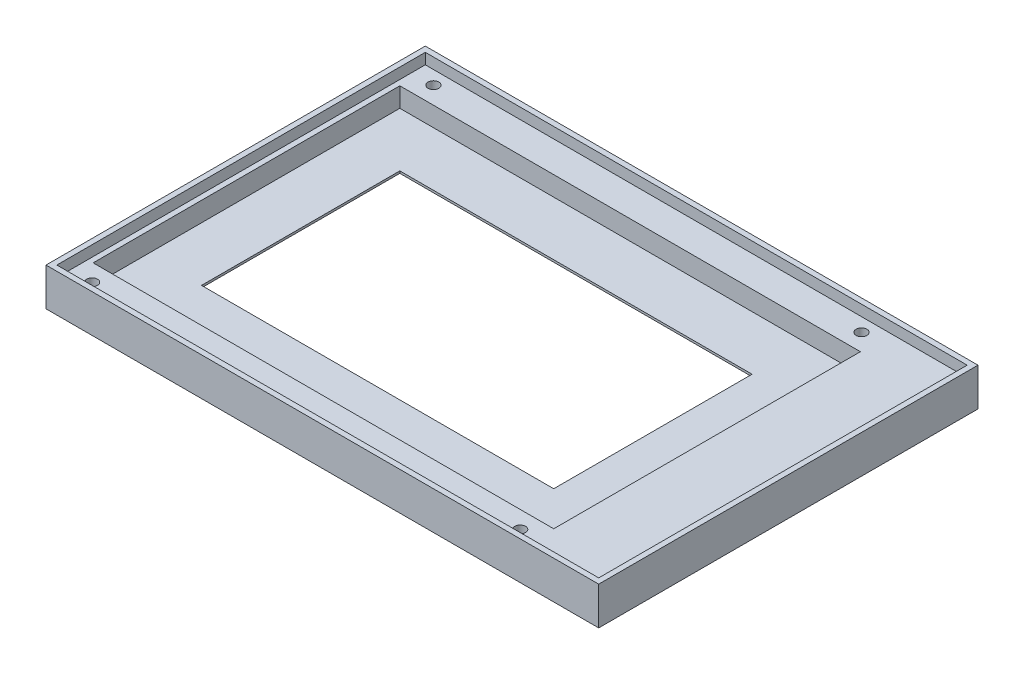
ISO-10303-21;
HEADER;
FILE_DESCRIPTION(('STEP AP214'),'2;1');
FILE_NAME('part.step','',(''),(''),'','','');
FILE_SCHEMA(('AUTOMOTIVE_DESIGN { 1 0 10303 214 1 1 1 1 }'));
ENDSEC;
DATA;
#1=APPLICATION_CONTEXT('core data for automotive mechanical design processes');
#2=APPLICATION_PROTOCOL_DEFINITION('international standard','automotive_design',2000,#1);
#3=PRODUCT_CONTEXT('',#1,'mechanical');
#4=PRODUCT('Part','Part','',(#3));
#5=PRODUCT_RELATED_PRODUCT_CATEGORY('part','',(#4));
#6=PRODUCT_DEFINITION_FORMATION('','',#4);
#7=PRODUCT_DEFINITION_CONTEXT('part definition',#1,'design');
#8=PRODUCT_DEFINITION('design','',#6,#7);
#9=PRODUCT_DEFINITION_SHAPE('','',#8);
#10=(LENGTH_UNIT() NAMED_UNIT(*) SI_UNIT(.MILLI.,.METRE.));
#11=(NAMED_UNIT(*) PLANE_ANGLE_UNIT() SI_UNIT($,.RADIAN.));
#12=(NAMED_UNIT(*) SI_UNIT($,.STERADIAN.) SOLID_ANGLE_UNIT());
#13=UNCERTAINTY_MEASURE_WITH_UNIT(LENGTH_MEASURE(1.E-05),#10,'distance_accuracy_value','');
#14=(GEOMETRIC_REPRESENTATION_CONTEXT(3) GLOBAL_UNCERTAINTY_ASSIGNED_CONTEXT((#13)) GLOBAL_UNIT_ASSIGNED_CONTEXT((#10,
#11,#12)) REPRESENTATION_CONTEXT('',''));
#15=CARTESIAN_POINT('',(0.,0.,0.));
#16=DIRECTION('',(0.,0.,1.));
#17=DIRECTION('',(1.,0.,0.));
#18=AXIS2_PLACEMENT_3D('',#15,#16,#17);
#19=CARTESIAN_POINT('',(-50.,1.,-34.));
#20=DIRECTION('',(-1.,0.,0.));
#21=DIRECTION('',(0.,0.,1.));
#22=AXIS2_PLACEMENT_3D('',#19,#20,#21);
#23=PLANE('',#22);
#24=DIRECTION('',(0.,0.,-1.));
#25=VECTOR('',#24,1.);
#26=CARTESIAN_POINT('',(-50.,1.,-34.));
#27=LINE('',#26,#25);
#28=CARTESIAN_POINT('',(-50.,1.,-3.5));
#29=VERTEX_POINT('',#28);
#30=CARTESIAN_POINT('',(-50.,1.,-34.));
#31=VERTEX_POINT('',#30);
#32=EDGE_CURVE('E293',#29,#31,#27,.T.);
#33=ORIENTED_EDGE('',*,*,#32,.F.);
#34=DIRECTION('',(0.,-1.,0.));
#35=VECTOR('',#34,1.);
#36=CARTESIAN_POINT('',(-50.,1.,-3.5));
#37=LINE('',#36,#35);
#38=CARTESIAN_POINT('',(-50.,0.,-3.5));
#39=VERTEX_POINT('',#38);
#40=EDGE_CURVE('E266',#29,#39,#37,.T.);
#41=ORIENTED_EDGE('',*,*,#40,.T.);
#42=DIRECTION('',(0.,0.,-1.));
#43=VECTOR('',#42,1.);
#44=CARTESIAN_POINT('',(-50.,0.,-34.));
#45=LINE('',#44,#43);
#46=CARTESIAN_POINT('',(-50.,0.,-34.));
#47=VERTEX_POINT('',#46);
#48=EDGE_CURVE('E305',#39,#47,#45,.T.);
#49=ORIENTED_EDGE('',*,*,#48,.T.);
#50=DIRECTION('',(0.,-1.,0.));
#51=VECTOR('',#50,1.);
#52=CARTESIAN_POINT('',(-50.,1.,-34.));
#53=LINE('',#52,#51);
#54=EDGE_CURVE('E314',#31,#47,#53,.T.);
#55=ORIENTED_EDGE('',*,*,#54,.F.);
#56=EDGE_LOOP('',(#33,#41,#49,#55));
#57=FACE_BOUND('',#56,.T.);
#58=ADVANCED_FACE('F35',(#57),#23,.F.);
#59=CARTESIAN_POINT('',(-46.,-1.,31.5));
#60=DIRECTION('',(0.,1.,0.));
#61=DIRECTION('',(0.,0.,1.));
#62=AXIS2_PLACEMENT_3D('',#59,#60,#61);
#63=CYLINDRICAL_SURFACE('',#62,0.999999999999998);
#64=CARTESIAN_POINT('',(-46.,5.,31.5));
#65=DIRECTION('',(0.,1.,0.));
#66=DIRECTION('',(0.,0.,1.));
#67=AXIS2_PLACEMENT_3D('',#64,#65,#66);
#68=CIRCLE('',#67,0.999999999999998);
#69=CARTESIAN_POINT('',(-46.,5.,32.5));
#70=VERTEX_POINT('',#69);
#71=EDGE_CURVE('E339',#70,#70,#68,.T.);
#72=ORIENTED_EDGE('',*,*,#71,.T.);
#73=EDGE_LOOP('',(#72));
#74=FACE_BOUND('',#73,.T.);
#75=CARTESIAN_POINT('',(-46.,1.,31.5));
#76=DIRECTION('',(0.,-1.,0.));
#77=DIRECTION('',(0.,0.,-1.));
#78=AXIS2_PLACEMENT_3D('',#75,#76,#77);
#79=CIRCLE('',#78,0.999999999999998);
#80=CARTESIAN_POINT('',(-46.,1.,30.5));
#81=VERTEX_POINT('',#80);
#82=EDGE_CURVE('E327',#81,#81,#79,.F.);
#83=ORIENTED_EDGE('',*,*,#82,.F.);
#84=EDGE_LOOP('',(#83));
#85=FACE_BOUND('',#84,.T.);
#86=ADVANCED_FACE('F463',(#74,#85),#63,.F.);
#87=CARTESIAN_POINT('',(33.,-1.,31.5));
#88=DIRECTION('',(0.,1.,0.));
#89=DIRECTION('',(0.,0.,1.));
#90=AXIS2_PLACEMENT_3D('',#87,#88,#89);
#91=CYLINDRICAL_SURFACE('',#90,0.999999999999998);
#92=CARTESIAN_POINT('',(33.,5.,31.5));
#93=DIRECTION('',(0.,1.,0.));
#94=DIRECTION('',(0.,0.,-1.));
#95=AXIS2_PLACEMENT_3D('',#92,#93,#94);
#96=CIRCLE('',#95,0.999999999999998);
#97=CARTESIAN_POINT('',(33.,5.,30.5));
#98=VERTEX_POINT('',#97);
#99=EDGE_CURVE('E336',#98,#98,#96,.T.);
#100=ORIENTED_EDGE('',*,*,#99,.T.);
#101=EDGE_LOOP('',(#100));
#102=FACE_BOUND('',#101,.T.);
#103=CARTESIAN_POINT('',(33.,1.,31.5));
#104=DIRECTION('',(0.,-1.,0.));
#105=DIRECTION('',(0.,0.,-1.));
#106=AXIS2_PLACEMENT_3D('',#103,#104,#105);
#107=CIRCLE('',#106,0.999999999999998);
#108=CARTESIAN_POINT('',(33.,1.,30.5));
#109=VERTEX_POINT('',#108);
#110=EDGE_CURVE('E324',#109,#109,#107,.F.);
#111=ORIENTED_EDGE('',*,*,#110,.F.);
#112=EDGE_LOOP('',(#111));
#113=FACE_BOUND('',#112,.T.);
#114=ADVANCED_FACE('F470',(#102,#113),#91,.F.);
#115=CARTESIAN_POINT('',(33.,-1.,-31.5));
#116=DIRECTION('',(0.,1.,0.));
#117=DIRECTION('',(0.,0.,1.));
#118=AXIS2_PLACEMENT_3D('',#115,#116,#117);
#119=CYLINDRICAL_SURFACE('',#118,0.999999999999998);
#120=CARTESIAN_POINT('',(33.,5.,-31.5));
#121=DIRECTION('',(0.,1.,0.));
#122=DIRECTION('',(0.,0.,1.));
#123=AXIS2_PLACEMENT_3D('',#120,#121,#122);
#124=CIRCLE('',#123,0.999999999999998);
#125=CARTESIAN_POINT('',(33.,5.,-30.5));
#126=VERTEX_POINT('',#125);
#127=EDGE_CURVE('E333',#126,#126,#124,.T.);
#128=ORIENTED_EDGE('',*,*,#127,.T.);
#129=EDGE_LOOP('',(#128));
#130=FACE_BOUND('',#129,.T.);
#131=CARTESIAN_POINT('',(33.,1.,-31.5));
#132=DIRECTION('',(0.,-1.,0.));
#133=DIRECTION('',(0.,0.,-1.));
#134=AXIS2_PLACEMENT_3D('',#131,#132,#133);
#135=CIRCLE('',#134,0.999999999999998);
#136=CARTESIAN_POINT('',(33.,1.,-32.5));
#137=VERTEX_POINT('',#136);
#138=EDGE_CURVE('E321',#137,#137,#135,.F.);
#139=ORIENTED_EDGE('',*,*,#138,.F.);
#140=EDGE_LOOP('',(#139));
#141=FACE_BOUND('',#140,.T.);
#142=ADVANCED_FACE('F532',(#130,#141),#119,.F.);
#143=CARTESIAN_POINT('',(-46.,-1.,-31.5));
#144=DIRECTION('',(0.,1.,0.));
#145=DIRECTION('',(0.,0.,1.));
#146=AXIS2_PLACEMENT_3D('',#143,#144,#145);
#147=CYLINDRICAL_SURFACE('',#146,0.999999999999998);
#148=CARTESIAN_POINT('',(-46.,5.,-31.5));
#149=DIRECTION('',(0.,1.,0.));
#150=DIRECTION('',(0.,0.,-1.));
#151=AXIS2_PLACEMENT_3D('',#148,#149,#150);
#152=CIRCLE('',#151,0.999999999999998);
#153=CARTESIAN_POINT('',(-46.,5.,-32.5));
#154=VERTEX_POINT('',#153);
#155=EDGE_CURVE('E330',#154,#154,#152,.T.);
#156=ORIENTED_EDGE('',*,*,#155,.T.);
#157=EDGE_LOOP('',(#156));
#158=FACE_BOUND('',#157,.T.);
#159=CARTESIAN_POINT('',(-46.,1.,-31.5));
#160=DIRECTION('',(0.,-1.,0.));
#161=DIRECTION('',(0.,0.,-1.));
#162=AXIS2_PLACEMENT_3D('',#159,#160,#161);
#163=CIRCLE('',#162,0.999999999999998);
#164=CARTESIAN_POINT('',(-46.,1.,-32.5));
#165=VERTEX_POINT('',#164);
#166=EDGE_CURVE('E313',#165,#165,#163,.F.);
#167=ORIENTED_EDGE('',*,*,#166,.F.);
#168=EDGE_LOOP('',(#167));
#169=FACE_BOUND('',#168,.T.);
#170=ADVANCED_FACE('F528',(#158,#169),#147,.F.);
#171=CARTESIAN_POINT('',(-51.,5.,35.));
#172=DIRECTION('',(1.,0.,0.));
#173=DIRECTION('',(0.,0.,-1.));
#174=AXIS2_PLACEMENT_3D('',#171,#172,#173);
#175=PLANE('',#174);
#176=DIRECTION('',(0.,0.,1.));
#177=VECTOR('',#176,1.);
#178=CARTESIAN_POINT('',(-51.,0.,35.));
#179=LINE('',#178,#177);
#180=CARTESIAN_POINT('',(-51.,0.,-35.));
#181=VERTEX_POINT('',#180);
#182=CARTESIAN_POINT('',(-51.,0.,-3.5));
#183=VERTEX_POINT('',#182);
#184=EDGE_CURVE('E375',#181,#183,#179,.T.);
#185=ORIENTED_EDGE('',*,*,#184,.T.);
#186=DIRECTION('',(0.,-1.,0.));
#187=VECTOR('',#186,1.);
#188=CARTESIAN_POINT('',(-51.,1.,-3.5));
#189=LINE('',#188,#187);
#190=CARTESIAN_POINT('',(-51.,1.,-3.5));
#191=VERTEX_POINT('',#190);
#192=EDGE_CURVE('E267',#191,#183,#189,.T.);
#193=ORIENTED_EDGE('',*,*,#192,.F.);
#194=DIRECTION('',(0.,0.,-1.));
#195=VECTOR('',#194,1.);
#196=CARTESIAN_POINT('',(-51.,1.,-3.5));
#197=LINE('',#196,#195);
#198=CARTESIAN_POINT('',(-51.,1.,3.5));
#199=VERTEX_POINT('',#198);
#200=EDGE_CURVE('E273',#199,#191,#197,.T.);
#201=ORIENTED_EDGE('',*,*,#200,.F.);
#202=DIRECTION('',(0.,1.,0.));
#203=VECTOR('',#202,1.);
#204=CARTESIAN_POINT('',(-51.,1.,3.5));
#205=LINE('',#204,#203);
#206=CARTESIAN_POINT('',(-51.,0.,3.5));
#207=VERTEX_POINT('',#206);
#208=EDGE_CURVE('E256',#207,#199,#205,.T.);
#209=ORIENTED_EDGE('',*,*,#208,.F.);
#210=CARTESIAN_POINT('',(-51.,0.,35.));
#211=VERTEX_POINT('',#210);
#212=EDGE_CURVE('E368',#207,#211,#179,.T.);
#213=ORIENTED_EDGE('',*,*,#212,.T.);
#214=DIRECTION('',(0.,-1.,0.));
#215=VECTOR('',#214,1.);
#216=CARTESIAN_POINT('',(-51.,5.,35.));
#217=LINE('',#216,#215);
#218=CARTESIAN_POINT('',(-51.,7.,35.));
#219=VERTEX_POINT('',#218);
#220=EDGE_CURVE('E393',#219,#211,#217,.T.);
#221=ORIENTED_EDGE('',*,*,#220,.F.);
#222=DIRECTION('',(0.,0.,1.));
#223=VECTOR('',#222,1.);
#224=CARTESIAN_POINT('',(-51.,7.,-35.));
#225=LINE('',#224,#223);
#226=CARTESIAN_POINT('',(-51.,7.,-35.));
#227=VERTEX_POINT('',#226);
#228=EDGE_CURVE('E209',#227,#219,#225,.T.);
#229=ORIENTED_EDGE('',*,*,#228,.F.);
#230=DIRECTION('',(0.,-1.,0.));
#231=VECTOR('',#230,1.);
#232=CARTESIAN_POINT('',(-51.,5.,-35.));
#233=LINE('',#232,#231);
#234=EDGE_CURVE('E384',#227,#181,#233,.T.);
#235=ORIENTED_EDGE('',*,*,#234,.T.);
#236=EDGE_LOOP('',(#185,#193,#201,#209,#213,#221,#229,#235));
#237=FACE_BOUND('',#236,.T.);
#238=ADVANCED_FACE('F37',(#237),#175,.F.);
#239=CARTESIAN_POINT('',(51.,5.,35.));
#240=DIRECTION('',(0.,0.,-1.));
#241=DIRECTION('',(-1.,0.,0.));
#242=AXIS2_PLACEMENT_3D('',#239,#240,#241);
#243=PLANE('',#242);
#244=DIRECTION('',(1.,0.,0.));
#245=VECTOR('',#244,1.);
#246=CARTESIAN_POINT('',(51.,0.,35.));
#247=LINE('',#246,#245);
#248=CARTESIAN_POINT('',(51.,0.,35.));
#249=VERTEX_POINT('',#248);
#250=EDGE_CURVE('E378',#211,#249,#247,.T.);
#251=ORIENTED_EDGE('',*,*,#250,.T.);
#252=DIRECTION('',(0.,-1.,0.));
#253=VECTOR('',#252,1.);
#254=CARTESIAN_POINT('',(51.,5.,35.));
#255=LINE('',#254,#253);
#256=CARTESIAN_POINT('',(51.,7.,35.));
#257=VERTEX_POINT('',#256);
#258=EDGE_CURVE('E390',#257,#249,#255,.T.);
#259=ORIENTED_EDGE('',*,*,#258,.F.);
#260=DIRECTION('',(1.,0.,0.));
#261=VECTOR('',#260,1.);
#262=CARTESIAN_POINT('',(-51.,7.,35.));
#263=LINE('',#262,#261);
#264=EDGE_CURVE('E233',#219,#257,#263,.T.);
#265=ORIENTED_EDGE('',*,*,#264,.F.);
#266=ORIENTED_EDGE('',*,*,#220,.T.);
#267=EDGE_LOOP('',(#251,#259,#265,#266));
#268=FACE_BOUND('',#267,.T.);
#269=ADVANCED_FACE('F521',(#268),#243,.F.);
#270=CARTESIAN_POINT('',(51.,5.,35.));
#271=DIRECTION('',(-1.,0.,0.));
#272=DIRECTION('',(0.,0.,1.));
#273=AXIS2_PLACEMENT_3D('',#270,#271,#272);
#274=PLANE('',#273);
#275=DIRECTION('',(0.,0.,-1.));
#276=VECTOR('',#275,1.);
#277=CARTESIAN_POINT('',(51.,0.,35.));
#278=LINE('',#277,#276);
#279=CARTESIAN_POINT('',(51.,0.,-35.));
#280=VERTEX_POINT('',#279);
#281=EDGE_CURVE('E380',#249,#280,#278,.T.);
#282=ORIENTED_EDGE('',*,*,#281,.T.);
#283=DIRECTION('',(0.,-1.,0.));
#284=VECTOR('',#283,1.);
#285=CARTESIAN_POINT('',(51.,5.,-35.));
#286=LINE('',#285,#284);
#287=CARTESIAN_POINT('',(51.,7.,-35.));
#288=VERTEX_POINT('',#287);
#289=EDGE_CURVE('E387',#288,#280,#286,.T.);
#290=ORIENTED_EDGE('',*,*,#289,.F.);
#291=DIRECTION('',(0.,0.,-1.));
#292=VECTOR('',#291,1.);
#293=CARTESIAN_POINT('',(51.,7.,35.));
#294=LINE('',#293,#292);
#295=EDGE_CURVE('E236',#257,#288,#294,.T.);
#296=ORIENTED_EDGE('',*,*,#295,.F.);
#297=ORIENTED_EDGE('',*,*,#258,.T.);
#298=EDGE_LOOP('',(#282,#290,#296,#297));
#299=FACE_BOUND('',#298,.T.);
#300=ADVANCED_FACE('F457',(#299),#274,.F.);
#301=CARTESIAN_POINT('',(51.,5.,-35.));
#302=DIRECTION('',(0.,0.,1.));
#303=DIRECTION('',(1.,0.,0.));
#304=AXIS2_PLACEMENT_3D('',#301,#302,#303);
#305=PLANE('',#304);
#306=DIRECTION('',(-1.,0.,0.));
#307=VECTOR('',#306,1.);
#308=CARTESIAN_POINT('',(51.,0.,-35.));
#309=LINE('',#308,#307);
#310=EDGE_CURVE('E382',#280,#181,#309,.T.);
#311=ORIENTED_EDGE('',*,*,#310,.T.);
#312=ORIENTED_EDGE('',*,*,#234,.F.);
#313=DIRECTION('',(-1.,0.,0.));
#314=VECTOR('',#313,1.);
#315=CARTESIAN_POINT('',(-51.,7.,-35.));
#316=LINE('',#315,#314);
#317=EDGE_CURVE('E239',#288,#227,#316,.T.);
#318=ORIENTED_EDGE('',*,*,#317,.F.);
#319=ORIENTED_EDGE('',*,*,#289,.T.);
#320=EDGE_LOOP('',(#311,#312,#318,#319));
#321=FACE_BOUND('',#320,.T.);
#322=ADVANCED_FACE('F449',(#321),#305,.F.);
#323=CARTESIAN_POINT('',(0.,5.,0.));
#324=DIRECTION('',(0.,1.,0.));
#325=DIRECTION('',(0.,0.,1.));
#326=AXIS2_PLACEMENT_3D('',#323,#324,#325);
#327=PLANE('',#326);
#328=DIRECTION('',(0.,0.,1.));
#329=VECTOR('',#328,1.);
#330=CARTESIAN_POINT('',(-50.,5.,34.));
#331=LINE('',#330,#329);
#332=CARTESIAN_POINT('',(-50.,5.,-34.));
#333=VERTEX_POINT('',#332);
#334=CARTESIAN_POINT('',(-50.,5.,34.));
#335=VERTEX_POINT('',#334);
#336=EDGE_CURVE('E50',#333,#335,#331,.T.);
#337=ORIENTED_EDGE('',*,*,#336,.T.);
#338=DIRECTION('',(1.,0.,0.));
#339=VECTOR('',#338,1.);
#340=CARTESIAN_POINT('',(50.,5.,34.));
#341=LINE('',#340,#339);
#342=CARTESIAN_POINT('',(50.,5.,34.));
#343=VERTEX_POINT('',#342);
#344=EDGE_CURVE('E54',#335,#343,#341,.T.);
#345=ORIENTED_EDGE('',*,*,#344,.T.);
#346=DIRECTION('',(0.,0.,-1.));
#347=VECTOR('',#346,1.);
#348=CARTESIAN_POINT('',(50.,5.,34.));
#349=LINE('',#348,#347);
#350=CARTESIAN_POINT('',(50.,5.,-34.));
#351=VERTEX_POINT('',#350);
#352=EDGE_CURVE('E223',#343,#351,#349,.T.);
#353=ORIENTED_EDGE('',*,*,#352,.T.);
#354=DIRECTION('',(-1.,0.,0.));
#355=VECTOR('',#354,1.);
#356=CARTESIAN_POINT('',(50.,5.,-34.));
#357=LINE('',#356,#355);
#358=EDGE_CURVE('E204',#351,#333,#357,.T.);
#359=ORIENTED_EDGE('',*,*,#358,.T.);
#360=EDGE_LOOP('',(#337,#345,#353,#359));
#361=FACE_BOUND('',#360,.T.);
#362=ORIENTED_EDGE('',*,*,#155,.F.);
#363=EDGE_LOOP('',(#362));
#364=FACE_BOUND('',#363,.T.);
#365=ORIENTED_EDGE('',*,*,#127,.F.);
#366=EDGE_LOOP('',(#365));
#367=FACE_BOUND('',#366,.T.);
#368=ORIENTED_EDGE('',*,*,#99,.F.);
#369=EDGE_LOOP('',(#368));
#370=FACE_BOUND('',#369,.T.);
#371=ORIENTED_EDGE('',*,*,#71,.F.);
#372=EDGE_LOOP('',(#371));
#373=FACE_BOUND('',#372,.T.);
#374=DIRECTION('',(0.,0.,-1.));
#375=VECTOR('',#374,1.);
#376=CARTESIAN_POINT('',(36.,5.,28.3));
#377=LINE('',#376,#375);
#378=CARTESIAN_POINT('',(36.,5.,28.3));
#379=VERTEX_POINT('',#378);
#380=CARTESIAN_POINT('',(36.,5.,-28.3));
#381=VERTEX_POINT('',#380);
#382=EDGE_CURVE('E342',#379,#381,#377,.T.);
#383=ORIENTED_EDGE('',*,*,#382,.F.);
#384=DIRECTION('',(1.,0.,0.));
#385=VECTOR('',#384,1.);
#386=CARTESIAN_POINT('',(-49.,5.,28.3));
#387=LINE('',#386,#385);
#388=CARTESIAN_POINT('',(-49.,5.,28.3));
#389=VERTEX_POINT('',#388);
#390=EDGE_CURVE('E347',#389,#379,#387,.T.);
#391=ORIENTED_EDGE('',*,*,#390,.F.);
#392=DIRECTION('',(0.,0.,1.));
#393=VECTOR('',#392,1.);
#394=CARTESIAN_POINT('',(-49.,5.,28.3));
#395=LINE('',#394,#393);
#396=CARTESIAN_POINT('',(-49.,5.,-28.3));
#397=VERTEX_POINT('',#396);
#398=EDGE_CURVE('E361',#397,#389,#395,.T.);
#399=ORIENTED_EDGE('',*,*,#398,.F.);
#400=DIRECTION('',(-1.,0.,0.));
#401=VECTOR('',#400,1.);
#402=CARTESIAN_POINT('',(-49.,5.,-28.3));
#403=LINE('',#402,#401);
#404=EDGE_CURVE('E358',#381,#397,#403,.T.);
#405=ORIENTED_EDGE('',*,*,#404,.F.);
#406=EDGE_LOOP('',(#383,#391,#399,#405));
#407=FACE_BOUND('',#406,.T.);
#408=ADVANCED_FACE('F446',(#361,#364,#367,#370,#373,#407),#327,.T.);
#409=CARTESIAN_POINT('',(0.,0.,0.));
#410=DIRECTION('',(0.,1.,0.));
#411=DIRECTION('',(0.,0.,1.));
#412=AXIS2_PLACEMENT_3D('',#409,#410,#411);
#413=PLANE('',#412);
#414=ORIENTED_EDGE('',*,*,#48,.F.);
#415=DIRECTION('',(-1.,0.,0.));
#416=VECTOR('',#415,1.);
#417=CARTESIAN_POINT('',(-50.,0.,-3.5));
#418=LINE('',#417,#416);
#419=EDGE_CURVE('E277',#39,#183,#418,.T.);
#420=ORIENTED_EDGE('',*,*,#419,.T.);
#421=ORIENTED_EDGE('',*,*,#184,.F.);
#422=ORIENTED_EDGE('',*,*,#310,.F.);
#423=ORIENTED_EDGE('',*,*,#281,.F.);
#424=ORIENTED_EDGE('',*,*,#250,.F.);
#425=ORIENTED_EDGE('',*,*,#212,.F.);
#426=DIRECTION('',(-1.,0.,0.));
#427=VECTOR('',#426,1.);
#428=CARTESIAN_POINT('',(-50.,0.,3.5));
#429=LINE('',#428,#427);
#430=CARTESIAN_POINT('',(-50.,0.,3.5));
#431=VERTEX_POINT('',#430);
#432=EDGE_CURVE('E270',#431,#207,#429,.T.);
#433=ORIENTED_EDGE('',*,*,#432,.F.);
#434=CARTESIAN_POINT('',(-50.,0.,34.));
#435=VERTEX_POINT('',#434);
#436=EDGE_CURVE('E306',#435,#431,#45,.T.);
#437=ORIENTED_EDGE('',*,*,#436,.F.);
#438=DIRECTION('',(-1.,0.,0.));
#439=VECTOR('',#438,1.);
#440=CARTESIAN_POINT('',(50.,0.,34.));
#441=LINE('',#440,#439);
#442=CARTESIAN_POINT('',(50.,0.,34.));
#443=VERTEX_POINT('',#442);
#444=EDGE_CURVE('E302',#443,#435,#441,.T.);
#445=ORIENTED_EDGE('',*,*,#444,.F.);
#446=DIRECTION('',(0.,0.,1.));
#447=VECTOR('',#446,1.);
#448=CARTESIAN_POINT('',(50.,0.,-34.));
#449=LINE('',#448,#447);
#450=CARTESIAN_POINT('',(50.,0.,-34.));
#451=VERTEX_POINT('',#450);
#452=EDGE_CURVE('E280',#451,#443,#449,.T.);
#453=ORIENTED_EDGE('',*,*,#452,.F.);
#454=DIRECTION('',(1.,0.,0.));
#455=VECTOR('',#454,1.);
#456=CARTESIAN_POINT('',(50.,0.,-34.));
#457=LINE('',#456,#455);
#458=EDGE_CURVE('E290',#47,#451,#457,.T.);
#459=ORIENTED_EDGE('',*,*,#458,.F.);
#460=EDGE_LOOP('',(#414,#420,#421,#422,#423,#424,#425,#433,#437,#445,#453,#459));
#461=FACE_BOUND('',#460,.T.);
#462=ADVANCED_FACE('F448',(#461),#413,.F.);
#463=CARTESIAN_POINT('',(36.,1.4,28.3));
#464=DIRECTION('',(1.,0.,0.));
#465=DIRECTION('',(0.,0.,-1.));
#466=AXIS2_PLACEMENT_3D('',#463,#464,#465);
#467=PLANE('',#466);
#468=ORIENTED_EDGE('',*,*,#382,.T.);
#469=DIRECTION('',(0.,1.,0.));
#470=VECTOR('',#469,1.);
#471=CARTESIAN_POINT('',(36.,1.4,-28.3));
#472=LINE('',#471,#470);
#473=CARTESIAN_POINT('',(36.,1.4,-28.3));
#474=VERTEX_POINT('',#473);
#475=EDGE_CURVE('E356',#474,#381,#472,.T.);
#476=ORIENTED_EDGE('',*,*,#475,.F.);
#477=DIRECTION('',(0.,0.,-1.));
#478=VECTOR('',#477,1.);
#479=CARTESIAN_POINT('',(36.,1.4,28.3));
#480=LINE('',#479,#478);
#481=CARTESIAN_POINT('',(36.,1.4,28.3));
#482=VERTEX_POINT('',#481);
#483=EDGE_CURVE('E343',#482,#474,#480,.T.);
#484=ORIENTED_EDGE('',*,*,#483,.F.);
#485=DIRECTION('',(0.,1.,0.));
#486=VECTOR('',#485,1.);
#487=CARTESIAN_POINT('',(36.,1.4,28.3));
#488=LINE('',#487,#486);
#489=EDGE_CURVE('E366',#482,#379,#488,.T.);
#490=ORIENTED_EDGE('',*,*,#489,.T.);
#491=EDGE_LOOP('',(#468,#476,#484,#490));
#492=FACE_BOUND('',#491,.T.);
#493=ADVANCED_FACE('F434',(#492),#467,.F.);
#494=CARTESIAN_POINT('',(-49.,1.4,28.3));
#495=DIRECTION('',(0.,0.,1.));
#496=DIRECTION('',(1.,0.,0.));
#497=AXIS2_PLACEMENT_3D('',#494,#495,#496);
#498=PLANE('',#497);
#499=ORIENTED_EDGE('',*,*,#390,.T.);
#500=ORIENTED_EDGE('',*,*,#489,.F.);
#501=DIRECTION('',(1.,0.,0.));
#502=VECTOR('',#501,1.);
#503=CARTESIAN_POINT('',(-49.,1.4,28.3));
#504=LINE('',#503,#502);
#505=CARTESIAN_POINT('',(-49.,1.4,28.3));
#506=VERTEX_POINT('',#505);
#507=EDGE_CURVE('E353',#506,#482,#504,.T.);
#508=ORIENTED_EDGE('',*,*,#507,.F.);
#509=DIRECTION('',(0.,1.,0.));
#510=VECTOR('',#509,1.);
#511=CARTESIAN_POINT('',(-49.,1.4,28.3));
#512=LINE('',#511,#510);
#513=EDGE_CURVE('E369',#506,#389,#512,.T.);
#514=ORIENTED_EDGE('',*,*,#513,.T.);
#515=EDGE_LOOP('',(#499,#500,#508,#514));
#516=FACE_BOUND('',#515,.T.);
#517=ADVANCED_FACE('F443',(#516),#498,.F.);
#518=CARTESIAN_POINT('',(-49.,1.4,28.3));
#519=DIRECTION('',(-1.,0.,0.));
#520=DIRECTION('',(0.,0.,1.));
#521=AXIS2_PLACEMENT_3D('',#518,#519,#520);
#522=PLANE('',#521);
#523=ORIENTED_EDGE('',*,*,#398,.T.);
#524=ORIENTED_EDGE('',*,*,#513,.F.);
#525=DIRECTION('',(0.,0.,1.));
#526=VECTOR('',#525,1.);
#527=CARTESIAN_POINT('',(-49.,1.4,28.3));
#528=LINE('',#527,#526);
#529=CARTESIAN_POINT('',(-49.,1.4,-28.3));
#530=VERTEX_POINT('',#529);
#531=EDGE_CURVE('E350',#530,#506,#528,.T.);
#532=ORIENTED_EDGE('',*,*,#531,.F.);
#533=DIRECTION('',(0.,1.,0.));
#534=VECTOR('',#533,1.);
#535=CARTESIAN_POINT('',(-49.,1.4,-28.3));
#536=LINE('',#535,#534);
#537=EDGE_CURVE('E371',#530,#397,#536,.T.);
#538=ORIENTED_EDGE('',*,*,#537,.T.);
#539=EDGE_LOOP('',(#523,#524,#532,#538));
#540=FACE_BOUND('',#539,.T.);
#541=ADVANCED_FACE('F441',(#540),#522,.F.);
#542=CARTESIAN_POINT('',(-49.,1.4,-28.3));
#543=DIRECTION('',(0.,0.,-1.));
#544=DIRECTION('',(-1.,0.,0.));
#545=AXIS2_PLACEMENT_3D('',#542,#543,#544);
#546=PLANE('',#545);
#547=ORIENTED_EDGE('',*,*,#404,.T.);
#548=ORIENTED_EDGE('',*,*,#537,.F.);
#549=DIRECTION('',(-1.,0.,0.));
#550=VECTOR('',#549,1.);
#551=CARTESIAN_POINT('',(-49.,1.4,-28.3));
#552=LINE('',#551,#550);
#553=EDGE_CURVE('E346',#474,#530,#552,.T.);
#554=ORIENTED_EDGE('',*,*,#553,.F.);
#555=ORIENTED_EDGE('',*,*,#475,.T.);
#556=EDGE_LOOP('',(#547,#548,#554,#555));
#557=FACE_BOUND('',#556,.T.);
#558=ADVANCED_FACE('F428',(#557),#546,.F.);
#559=CARTESIAN_POINT('',(0.,1.4,0.));
#560=DIRECTION('',(0.,-1.,0.));
#561=DIRECTION('',(0.,0.,-1.));
#562=AXIS2_PLACEMENT_3D('',#559,#560,#561);
#563=PLANE('',#562);
#564=DIRECTION('',(1.,0.,0.));
#565=VECTOR('',#564,1.);
#566=CARTESIAN_POINT('',(-39.,1.4,18.3));
#567=LINE('',#566,#565);
#568=CARTESIAN_POINT('',(-39.,1.4,18.3));
#569=VERTEX_POINT('',#568);
#570=CARTESIAN_POINT('',(26.,1.4,18.3));
#571=VERTEX_POINT('',#570);
#572=EDGE_CURVE('E244',#569,#571,#567,.T.);
#573=ORIENTED_EDGE('',*,*,#572,.F.);
#574=DIRECTION('',(0.,0.,1.));
#575=VECTOR('',#574,1.);
#576=CARTESIAN_POINT('',(-39.,1.4,-18.3));
#577=LINE('',#576,#575);
#578=CARTESIAN_POINT('',(-39.,1.4,-18.3));
#579=VERTEX_POINT('',#578);
#580=EDGE_CURVE('E242',#579,#569,#577,.T.);
#581=ORIENTED_EDGE('',*,*,#580,.F.);
#582=DIRECTION('',(-1.,0.,0.));
#583=VECTOR('',#582,1.);
#584=CARTESIAN_POINT('',(-39.,1.4,-18.3));
#585=LINE('',#584,#583);
#586=CARTESIAN_POINT('',(26.,1.4,-18.3));
#587=VERTEX_POINT('',#586);
#588=EDGE_CURVE('E250',#587,#579,#585,.T.);
#589=ORIENTED_EDGE('',*,*,#588,.F.);
#590=DIRECTION('',(0.,0.,-1.));
#591=VECTOR('',#590,1.);
#592=CARTESIAN_POINT('',(26.,1.4,-18.3));
#593=LINE('',#592,#591);
#594=EDGE_CURVE('E247',#571,#587,#593,.T.);
#595=ORIENTED_EDGE('',*,*,#594,.F.);
#596=EDGE_LOOP('',(#573,#581,#589,#595));
#597=FACE_BOUND('',#596,.T.);
#598=ORIENTED_EDGE('',*,*,#483,.T.);
#599=ORIENTED_EDGE('',*,*,#553,.T.);
#600=ORIENTED_EDGE('',*,*,#531,.T.);
#601=ORIENTED_EDGE('',*,*,#507,.T.);
#602=EDGE_LOOP('',(#598,#599,#600,#601));
#603=FACE_BOUND('',#602,.T.);
#604=ADVANCED_FACE('F425',(#597,#603),#563,.F.);
#605=CARTESIAN_POINT('',(0.,1.,0.));
#606=DIRECTION('',(0.,-1.,0.));
#607=DIRECTION('',(0.,0.,-1.));
#608=AXIS2_PLACEMENT_3D('',#605,#606,#607);
#609=PLANE('',#608);
#610=DIRECTION('',(0.,0.,-1.));
#611=VECTOR('',#610,1.);
#612=CARTESIAN_POINT('',(-39.,1.,0.));
#613=LINE('',#612,#611);
#614=CARTESIAN_POINT('',(-39.,1.,18.3));
#615=VERTEX_POINT('',#614);
#616=CARTESIAN_POINT('',(-39.,1.,-18.3));
#617=VERTEX_POINT('',#616);
#618=EDGE_CURVE('E11',#615,#617,#613,.T.);
#619=ORIENTED_EDGE('',*,*,#618,.F.);
#620=DIRECTION('',(-1.,0.,0.));
#621=VECTOR('',#620,1.);
#622=CARTESIAN_POINT('',(0.,1.,18.3));
#623=LINE('',#622,#621);
#624=CARTESIAN_POINT('',(26.,1.,18.3));
#625=VERTEX_POINT('',#624);
#626=EDGE_CURVE('E396',#625,#615,#623,.T.);
#627=ORIENTED_EDGE('',*,*,#626,.F.);
#628=DIRECTION('',(0.,0.,1.));
#629=VECTOR('',#628,1.);
#630=CARTESIAN_POINT('',(26.,1.,0.));
#631=LINE('',#630,#629);
#632=CARTESIAN_POINT('',(26.,1.,-18.3));
#633=VERTEX_POINT('',#632);
#634=EDGE_CURVE('E400',#633,#625,#631,.T.);
#635=ORIENTED_EDGE('',*,*,#634,.F.);
#636=DIRECTION('',(1.,0.,0.));
#637=VECTOR('',#636,1.);
#638=CARTESIAN_POINT('',(0.,1.,-18.3));
#639=LINE('',#638,#637);
#640=EDGE_CURVE('E43',#617,#633,#639,.T.);
#641=ORIENTED_EDGE('',*,*,#640,.F.);
#642=EDGE_LOOP('',(#619,#627,#635,#641));
#643=FACE_BOUND('',#642,.T.);
#644=DIRECTION('',(0.,0.,1.));
#645=VECTOR('',#644,1.);
#646=CARTESIAN_POINT('',(50.,1.,-34.));
#647=LINE('',#646,#645);
#648=CARTESIAN_POINT('',(50.,1.,-34.));
#649=VERTEX_POINT('',#648);
#650=CARTESIAN_POINT('',(50.,1.,34.));
#651=VERTEX_POINT('',#650);
#652=EDGE_CURVE('E286',#649,#651,#647,.T.);
#653=ORIENTED_EDGE('',*,*,#652,.T.);
#654=DIRECTION('',(-1.,0.,0.));
#655=VECTOR('',#654,1.);
#656=CARTESIAN_POINT('',(50.,1.,34.));
#657=LINE('',#656,#655);
#658=CARTESIAN_POINT('',(-50.,1.,34.));
#659=VERTEX_POINT('',#658);
#660=EDGE_CURVE('E289',#651,#659,#657,.T.);
#661=ORIENTED_EDGE('',*,*,#660,.T.);
#662=CARTESIAN_POINT('',(-50.,1.,3.5));
#663=VERTEX_POINT('',#662);
#664=EDGE_CURVE('E294',#659,#663,#27,.T.);
#665=ORIENTED_EDGE('',*,*,#664,.T.);
#666=DIRECTION('',(-1.,0.,0.));
#667=VECTOR('',#666,1.);
#668=CARTESIAN_POINT('',(-50.,1.,3.5));
#669=LINE('',#668,#667);
#670=EDGE_CURVE('E283',#663,#199,#669,.T.);
#671=ORIENTED_EDGE('',*,*,#670,.T.);
#672=ORIENTED_EDGE('',*,*,#200,.T.);
#673=DIRECTION('',(-1.,0.,0.));
#674=VECTOR('',#673,1.);
#675=CARTESIAN_POINT('',(-50.,1.,-3.5));
#676=LINE('',#675,#674);
#677=EDGE_CURVE('E281',#29,#191,#676,.T.);
#678=ORIENTED_EDGE('',*,*,#677,.F.);
#679=ORIENTED_EDGE('',*,*,#32,.T.);
#680=DIRECTION('',(1.,0.,0.));
#681=VECTOR('',#680,1.);
#682=CARTESIAN_POINT('',(50.,1.,-34.));
#683=LINE('',#682,#681);
#684=EDGE_CURVE('E297',#31,#649,#683,.T.);
#685=ORIENTED_EDGE('',*,*,#684,.T.);
#686=EDGE_LOOP('',(#653,#661,#665,#671,#672,#678,#679,#685));
#687=FACE_BOUND('',#686,.T.);
#688=ORIENTED_EDGE('',*,*,#166,.T.);
#689=EDGE_LOOP('',(#688));
#690=FACE_BOUND('',#689,.T.);
#691=ORIENTED_EDGE('',*,*,#138,.T.);
#692=EDGE_LOOP('',(#691));
#693=FACE_BOUND('',#692,.T.);
#694=ORIENTED_EDGE('',*,*,#110,.T.);
#695=EDGE_LOOP('',(#694));
#696=FACE_BOUND('',#695,.T.);
#697=ORIENTED_EDGE('',*,*,#82,.T.);
#698=EDGE_LOOP('',(#697));
#699=FACE_BOUND('',#698,.T.);
#700=ADVANCED_FACE('F415',(#643,#687,#690,#693,#696,#699),#609,.T.);
#701=CARTESIAN_POINT('',(50.,1.,-34.));
#702=DIRECTION('',(1.,0.,0.));
#703=DIRECTION('',(0.,0.,-1.));
#704=AXIS2_PLACEMENT_3D('',#701,#702,#703);
#705=PLANE('',#704);
#706=ORIENTED_EDGE('',*,*,#452,.T.);
#707=DIRECTION('',(0.,-1.,0.));
#708=VECTOR('',#707,1.);
#709=CARTESIAN_POINT('',(50.,1.,34.));
#710=LINE('',#709,#708);
#711=EDGE_CURVE('E300',#651,#443,#710,.T.);
#712=ORIENTED_EDGE('',*,*,#711,.F.);
#713=ORIENTED_EDGE('',*,*,#652,.F.);
#714=DIRECTION('',(0.,-1.,0.));
#715=VECTOR('',#714,1.);
#716=CARTESIAN_POINT('',(50.,1.,-34.));
#717=LINE('',#716,#715);
#718=EDGE_CURVE('E311',#649,#451,#717,.T.);
#719=ORIENTED_EDGE('',*,*,#718,.T.);
#720=EDGE_LOOP('',(#706,#712,#713,#719));
#721=FACE_BOUND('',#720,.T.);
#722=ADVANCED_FACE('F486',(#721),#705,.F.);
#723=CARTESIAN_POINT('',(50.,1.,-34.));
#724=DIRECTION('',(0.,0.,-1.));
#725=DIRECTION('',(-1.,0.,0.));
#726=AXIS2_PLACEMENT_3D('',#723,#724,#725);
#727=PLANE('',#726);
#728=ORIENTED_EDGE('',*,*,#458,.T.);
#729=ORIENTED_EDGE('',*,*,#718,.F.);
#730=ORIENTED_EDGE('',*,*,#684,.F.);
#731=ORIENTED_EDGE('',*,*,#54,.T.);
#732=EDGE_LOOP('',(#728,#729,#730,#731));
#733=FACE_BOUND('',#732,.T.);
#734=ADVANCED_FACE('F478',(#733),#727,.F.);
#735=ORIENTED_EDGE('',*,*,#436,.T.);
#736=DIRECTION('',(0.,1.,0.));
#737=VECTOR('',#736,1.);
#738=CARTESIAN_POINT('',(-50.,1.,3.5));
#739=LINE('',#738,#737);
#740=EDGE_CURVE('E263',#431,#663,#739,.T.);
#741=ORIENTED_EDGE('',*,*,#740,.T.);
#742=ORIENTED_EDGE('',*,*,#664,.F.);
#743=DIRECTION('',(0.,-1.,0.));
#744=VECTOR('',#743,1.);
#745=CARTESIAN_POINT('',(-50.,1.,34.));
#746=LINE('',#745,#744);
#747=EDGE_CURVE('E317',#659,#435,#746,.T.);
#748=ORIENTED_EDGE('',*,*,#747,.T.);
#749=EDGE_LOOP('',(#735,#741,#742,#748));
#750=FACE_BOUND('',#749,.T.);
#751=ADVANCED_FACE('F466',(#750),#23,.F.);
#752=CARTESIAN_POINT('',(50.,1.,34.));
#753=DIRECTION('',(0.,0.,1.));
#754=DIRECTION('',(1.,0.,0.));
#755=AXIS2_PLACEMENT_3D('',#752,#753,#754);
#756=PLANE('',#755);
#757=ORIENTED_EDGE('',*,*,#444,.T.);
#758=ORIENTED_EDGE('',*,*,#747,.F.);
#759=ORIENTED_EDGE('',*,*,#660,.F.);
#760=ORIENTED_EDGE('',*,*,#711,.T.);
#761=EDGE_LOOP('',(#757,#758,#759,#760));
#762=FACE_BOUND('',#761,.T.);
#763=ADVANCED_FACE('F477',(#762),#756,.F.);
#764=CARTESIAN_POINT('',(-50.,1.,-3.5));
#765=DIRECTION('',(0.,0.,-1.));
#766=DIRECTION('',(-1.,0.,0.));
#767=AXIS2_PLACEMENT_3D('',#764,#765,#766);
#768=PLANE('',#767);
#769=ORIENTED_EDGE('',*,*,#192,.T.);
#770=ORIENTED_EDGE('',*,*,#419,.F.);
#771=ORIENTED_EDGE('',*,*,#40,.F.);
#772=ORIENTED_EDGE('',*,*,#677,.T.);
#773=EDGE_LOOP('',(#769,#770,#771,#772));
#774=FACE_BOUND('',#773,.T.);
#775=ADVANCED_FACE('F484',(#774),#768,.F.);
#776=CARTESIAN_POINT('',(-50.,1.,3.5));
#777=DIRECTION('',(0.,0.,1.));
#778=DIRECTION('',(1.,0.,0.));
#779=AXIS2_PLACEMENT_3D('',#776,#777,#778);
#780=PLANE('',#779);
#781=ORIENTED_EDGE('',*,*,#208,.T.);
#782=ORIENTED_EDGE('',*,*,#670,.F.);
#783=ORIENTED_EDGE('',*,*,#740,.F.);
#784=ORIENTED_EDGE('',*,*,#432,.T.);
#785=EDGE_LOOP('',(#781,#782,#783,#784));
#786=FACE_BOUND('',#785,.T.);
#787=ADVANCED_FACE('F498',(#786),#780,.F.);
#788=CARTESIAN_POINT('',(-39.,-8.6,-18.3));
#789=DIRECTION('',(-1.,0.,0.));
#790=DIRECTION('',(0.,0.,1.));
#791=AXIS2_PLACEMENT_3D('',#788,#789,#790);
#792=PLANE('',#791);
#793=ORIENTED_EDGE('',*,*,#618,.T.);
#794=DIRECTION('',(0.,1.,0.));
#795=VECTOR('',#794,1.);
#796=CARTESIAN_POINT('',(-39.,-8.6,-18.3));
#797=LINE('',#796,#795);
#798=EDGE_CURVE('E254',#617,#579,#797,.T.);
#799=ORIENTED_EDGE('',*,*,#798,.T.);
#800=ORIENTED_EDGE('',*,*,#580,.T.);
#801=DIRECTION('',(0.,1.,0.));
#802=VECTOR('',#801,1.);
#803=CARTESIAN_POINT('',(-39.,-8.6,18.3));
#804=LINE('',#803,#802);
#805=EDGE_CURVE('E253',#615,#569,#804,.T.);
#806=ORIENTED_EDGE('',*,*,#805,.F.);
#807=EDGE_LOOP('',(#793,#799,#800,#806));
#808=FACE_BOUND('',#807,.T.);
#809=ADVANCED_FACE('F422',(#808),#792,.F.);
#810=CARTESIAN_POINT('',(-39.,-8.6,-18.3));
#811=DIRECTION('',(0.,0.,-1.));
#812=DIRECTION('',(-1.,0.,0.));
#813=AXIS2_PLACEMENT_3D('',#810,#811,#812);
#814=PLANE('',#813);
#815=ORIENTED_EDGE('',*,*,#640,.T.);
#816=DIRECTION('',(0.,1.,0.));
#817=VECTOR('',#816,1.);
#818=CARTESIAN_POINT('',(26.,-8.6,-18.3));
#819=LINE('',#818,#817);
#820=EDGE_CURVE('E257',#633,#587,#819,.T.);
#821=ORIENTED_EDGE('',*,*,#820,.T.);
#822=ORIENTED_EDGE('',*,*,#588,.T.);
#823=ORIENTED_EDGE('',*,*,#798,.F.);
#824=EDGE_LOOP('',(#815,#821,#822,#823));
#825=FACE_BOUND('',#824,.T.);
#826=ADVANCED_FACE('F406',(#825),#814,.F.);
#827=CARTESIAN_POINT('',(26.,-8.6,-18.3));
#828=DIRECTION('',(1.,0.,0.));
#829=DIRECTION('',(0.,0.,-1.));
#830=AXIS2_PLACEMENT_3D('',#827,#828,#829);
#831=PLANE('',#830);
#832=ORIENTED_EDGE('',*,*,#634,.T.);
#833=DIRECTION('',(0.,1.,0.));
#834=VECTOR('',#833,1.);
#835=CARTESIAN_POINT('',(26.,-8.6,18.3));
#836=LINE('',#835,#834);
#837=EDGE_CURVE('E259',#625,#571,#836,.T.);
#838=ORIENTED_EDGE('',*,*,#837,.T.);
#839=ORIENTED_EDGE('',*,*,#594,.T.);
#840=ORIENTED_EDGE('',*,*,#820,.F.);
#841=EDGE_LOOP('',(#832,#838,#839,#840));
#842=FACE_BOUND('',#841,.T.);
#843=ADVANCED_FACE('F411',(#842),#831,.F.);
#844=CARTESIAN_POINT('',(-39.,-8.6,18.3));
#845=DIRECTION('',(0.,0.,1.));
#846=DIRECTION('',(1.,0.,0.));
#847=AXIS2_PLACEMENT_3D('',#844,#845,#846);
#848=PLANE('',#847);
#849=ORIENTED_EDGE('',*,*,#626,.T.);
#850=ORIENTED_EDGE('',*,*,#805,.T.);
#851=ORIENTED_EDGE('',*,*,#572,.T.);
#852=ORIENTED_EDGE('',*,*,#837,.F.);
#853=EDGE_LOOP('',(#849,#850,#851,#852));
#854=FACE_BOUND('',#853,.T.);
#855=ADVANCED_FACE('F419',(#854),#848,.F.);
#856=CARTESIAN_POINT('',(0.,7.,0.));
#857=DIRECTION('',(0.,1.,0.));
#858=DIRECTION('',(0.,0.,1.));
#859=AXIS2_PLACEMENT_3D('',#856,#857,#858);
#860=PLANE('',#859);
#861=ORIENTED_EDGE('',*,*,#228,.T.);
#862=ORIENTED_EDGE('',*,*,#264,.T.);
#863=ORIENTED_EDGE('',*,*,#295,.T.);
#864=ORIENTED_EDGE('',*,*,#317,.T.);
#865=EDGE_LOOP('',(#861,#862,#863,#864));
#866=FACE_BOUND('',#865,.T.);
#867=DIRECTION('',(1.,0.,0.));
#868=VECTOR('',#867,1.);
#869=CARTESIAN_POINT('',(50.,7.,34.));
#870=LINE('',#869,#868);
#871=CARTESIAN_POINT('',(-50.,7.,34.));
#872=VERTEX_POINT('',#871);
#873=CARTESIAN_POINT('',(50.,7.,34.));
#874=VERTEX_POINT('',#873);
#875=EDGE_CURVE('E203',#872,#874,#870,.T.);
#876=ORIENTED_EDGE('',*,*,#875,.F.);
#877=DIRECTION('',(0.,0.,1.));
#878=VECTOR('',#877,1.);
#879=CARTESIAN_POINT('',(-50.,7.,34.));
#880=LINE('',#879,#878);
#881=CARTESIAN_POINT('',(-50.,7.,-34.));
#882=VERTEX_POINT('',#881);
#883=EDGE_CURVE('E194',#882,#872,#880,.T.);
#884=ORIENTED_EDGE('',*,*,#883,.F.);
#885=DIRECTION('',(-1.,0.,0.));
#886=VECTOR('',#885,1.);
#887=CARTESIAN_POINT('',(50.,7.,-34.));
#888=LINE('',#887,#886);
#889=CARTESIAN_POINT('',(50.,7.,-34.));
#890=VERTEX_POINT('',#889);
#891=EDGE_CURVE('E217',#890,#882,#888,.T.);
#892=ORIENTED_EDGE('',*,*,#891,.F.);
#893=DIRECTION('',(0.,0.,-1.));
#894=VECTOR('',#893,1.);
#895=CARTESIAN_POINT('',(50.,7.,34.));
#896=LINE('',#895,#894);
#897=EDGE_CURVE('E215',#874,#890,#896,.T.);
#898=ORIENTED_EDGE('',*,*,#897,.F.);
#899=EDGE_LOOP('',(#876,#884,#892,#898));
#900=FACE_BOUND('',#899,.T.);
#901=ADVANCED_FACE('F213',(#866,#900),#860,.T.);
#902=CARTESIAN_POINT('',(-50.,7.,34.));
#903=DIRECTION('',(1.,0.,0.));
#904=DIRECTION('',(0.,0.,-1.));
#905=AXIS2_PLACEMENT_3D('',#902,#903,#904);
#906=PLANE('',#905);
#907=ORIENTED_EDGE('',*,*,#336,.F.);
#908=DIRECTION('',(0.,-1.,0.));
#909=VECTOR('',#908,1.);
#910=CARTESIAN_POINT('',(-50.,7.,-34.));
#911=LINE('',#910,#909);
#912=EDGE_CURVE('E199',#882,#333,#911,.T.);
#913=ORIENTED_EDGE('',*,*,#912,.F.);
#914=ORIENTED_EDGE('',*,*,#883,.T.);
#915=DIRECTION('',(0.,-1.,0.));
#916=VECTOR('',#915,1.);
#917=CARTESIAN_POINT('',(-50.,7.,34.));
#918=LINE('',#917,#916);
#919=EDGE_CURVE('E197',#872,#335,#918,.T.);
#920=ORIENTED_EDGE('',*,*,#919,.T.);
#921=EDGE_LOOP('',(#907,#913,#914,#920));
#922=FACE_BOUND('',#921,.T.);
#923=ADVANCED_FACE('F196',(#922),#906,.T.);
#924=CARTESIAN_POINT('',(50.,7.,34.));
#925=DIRECTION('',(0.,0.,-1.));
#926=DIRECTION('',(-1.,0.,0.));
#927=AXIS2_PLACEMENT_3D('',#924,#925,#926);
#928=PLANE('',#927);
#929=ORIENTED_EDGE('',*,*,#344,.F.);
#930=ORIENTED_EDGE('',*,*,#919,.F.);
#931=ORIENTED_EDGE('',*,*,#875,.T.);
#932=DIRECTION('',(0.,-1.,0.));
#933=VECTOR('',#932,1.);
#934=CARTESIAN_POINT('',(50.,7.,34.));
#935=LINE('',#934,#933);
#936=EDGE_CURVE('E210',#874,#343,#935,.T.);
#937=ORIENTED_EDGE('',*,*,#936,.T.);
#938=EDGE_LOOP('',(#929,#930,#931,#937));
#939=FACE_BOUND('',#938,.T.);
#940=ADVANCED_FACE('F207',(#939),#928,.T.);
#941=CARTESIAN_POINT('',(50.,7.,34.));
#942=DIRECTION('',(-1.,0.,0.));
#943=DIRECTION('',(0.,0.,1.));
#944=AXIS2_PLACEMENT_3D('',#941,#942,#943);
#945=PLANE('',#944);
#946=ORIENTED_EDGE('',*,*,#352,.F.);
#947=ORIENTED_EDGE('',*,*,#936,.F.);
#948=ORIENTED_EDGE('',*,*,#897,.T.);
#949=DIRECTION('',(0.,-1.,0.));
#950=VECTOR('',#949,1.);
#951=CARTESIAN_POINT('',(50.,7.,-34.));
#952=LINE('',#951,#950);
#953=EDGE_CURVE('E227',#890,#351,#952,.T.);
#954=ORIENTED_EDGE('',*,*,#953,.T.);
#955=EDGE_LOOP('',(#946,#947,#948,#954));
#956=FACE_BOUND('',#955,.T.);
#957=ADVANCED_FACE('F667',(#956),#945,.T.);
#958=CARTESIAN_POINT('',(50.,7.,-34.));
#959=DIRECTION('',(0.,0.,1.));
#960=DIRECTION('',(1.,0.,0.));
#961=AXIS2_PLACEMENT_3D('',#958,#959,#960);
#962=PLANE('',#961);
#963=ORIENTED_EDGE('',*,*,#358,.F.);
#964=ORIENTED_EDGE('',*,*,#953,.F.);
#965=ORIENTED_EDGE('',*,*,#891,.T.);
#966=ORIENTED_EDGE('',*,*,#912,.T.);
#967=EDGE_LOOP('',(#963,#964,#965,#966));
#968=FACE_BOUND('',#967,.T.);
#969=ADVANCED_FACE('F674',(#968),#962,.T.);
#970=CLOSED_SHELL('',(#58,#86,#114,#142,#170,#238,#269,#300,#322,#408,#462,#493,#517,#541,#558,
#604,#700,#722,#734,#751,#763,#775,#787,#809,#826,#843,#855,#901,#923,#940,#957,#969));
#971=MANIFOLD_SOLID_BREP('B2',#970);
#972=ADVANCED_BREP_SHAPE_REPRESENTATION('',(#18,#971),#14);
#973=SHAPE_DEFINITION_REPRESENTATION(#9,#972);
ENDSEC;
END-ISO-10303-21;
